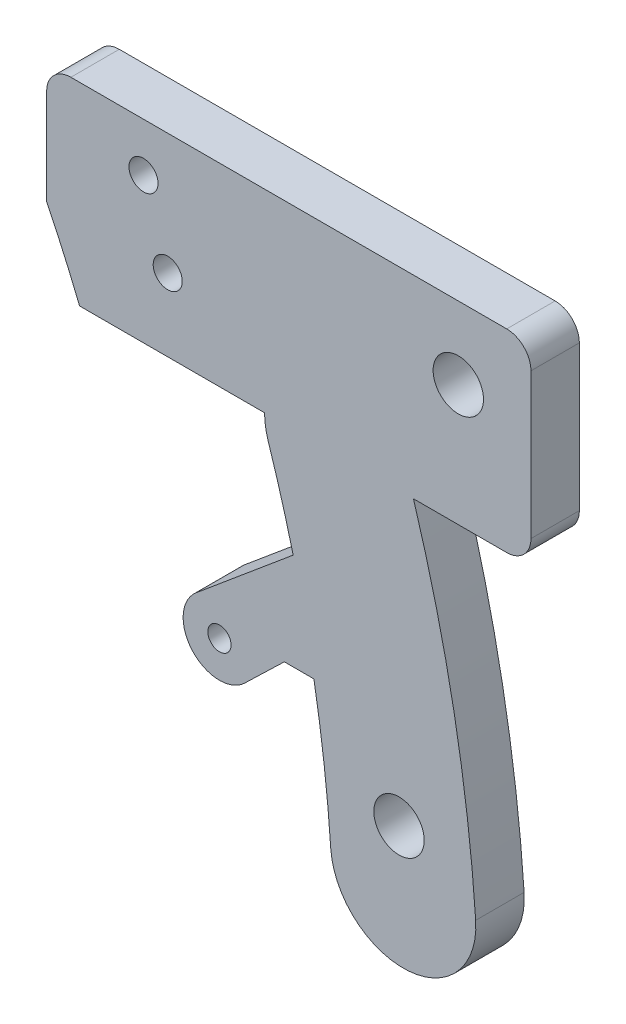
ISO-10303-21;
HEADER;
FILE_DESCRIPTION(('STEP AP214'),'2;1');
FILE_NAME('part.step','',(''),(''),'','','');
FILE_SCHEMA(('AUTOMOTIVE_DESIGN { 1 0 10303 214 1 1 1 1 }'));
ENDSEC;
DATA;
#1=APPLICATION_CONTEXT('core data for automotive mechanical design processes');
#2=APPLICATION_PROTOCOL_DEFINITION('international standard','automotive_design',2000,#1);
#3=PRODUCT_CONTEXT('',#1,'mechanical');
#4=PRODUCT('Part','Part','',(#3));
#5=PRODUCT_RELATED_PRODUCT_CATEGORY('part','',(#4));
#6=PRODUCT_DEFINITION_FORMATION('','',#4);
#7=PRODUCT_DEFINITION_CONTEXT('part definition',#1,'design');
#8=PRODUCT_DEFINITION('design','',#6,#7);
#9=PRODUCT_DEFINITION_SHAPE('','',#8);
#10=(LENGTH_UNIT() NAMED_UNIT(*) SI_UNIT(.MILLI.,.METRE.));
#11=(NAMED_UNIT(*) PLANE_ANGLE_UNIT() SI_UNIT($,.RADIAN.));
#12=(NAMED_UNIT(*) SI_UNIT($,.STERADIAN.) SOLID_ANGLE_UNIT());
#13=UNCERTAINTY_MEASURE_WITH_UNIT(LENGTH_MEASURE(1.E-05),#10,'distance_accuracy_value','');
#14=(GEOMETRIC_REPRESENTATION_CONTEXT(3) GLOBAL_UNCERTAINTY_ASSIGNED_CONTEXT((#13)) GLOBAL_UNIT_ASSIGNED_CONTEXT((#10,
#11,#12)) REPRESENTATION_CONTEXT('',''));
#15=CARTESIAN_POINT('',(0.,0.,0.));
#16=DIRECTION('',(0.,0.,1.));
#17=DIRECTION('',(1.,0.,0.));
#18=AXIS2_PLACEMENT_3D('',#15,#16,#17);
#19=CARTESIAN_POINT('',(0.,0.,6.35));
#20=DIRECTION('',(0.,0.,-1.));
#21=DIRECTION('',(-1.,0.,0.));
#22=AXIS2_PLACEMENT_3D('',#19,#20,#21);
#23=CYLINDRICAL_SURFACE('',#22,174.625);
#24=DIRECTION('',(0.,0.,1.));
#25=VECTOR('',#24,1.);
#26=CARTESIAN_POINT('',(169.282889621928,42.8625,-25.6306640082541));
#27=LINE('',#26,#25);
#28=CARTESIAN_POINT('',(169.282889621928,42.8625,0.));
#29=VERTEX_POINT('',#28);
#30=CARTESIAN_POINT('',(169.282889621928,42.8625,6.35));
#31=VERTEX_POINT('',#30);
#32=EDGE_CURVE('E50',#29,#31,#27,.T.);
#33=ORIENTED_EDGE('',*,*,#32,.T.);
#34=CARTESIAN_POINT('',(0.,0.,6.35));
#35=DIRECTION('',(0.,0.,1.));
#36=DIRECTION('',(1.,0.,0.));
#37=AXIS2_PLACEMENT_3D('',#34,#35,#36);
#38=CIRCLE('',#37,174.625);
#39=CARTESIAN_POINT('',(166.0027250575,54.1939655172414,6.35));
#40=VERTEX_POINT('',#39);
#41=EDGE_CURVE('E298',#31,#40,#38,.T.);
#42=ORIENTED_EDGE('',*,*,#41,.T.);
#43=DIRECTION('',(0.,0.,-1.));
#44=VECTOR('',#43,1.);
#45=CARTESIAN_POINT('',(166.0027250575,54.1939655172414,6.35));
#46=LINE('',#45,#44);
#47=CARTESIAN_POINT('',(166.0027250575,54.1939655172414,0.));
#48=VERTEX_POINT('',#47);
#49=EDGE_CURVE('E225',#40,#48,#46,.T.);
#50=ORIENTED_EDGE('',*,*,#49,.T.);
#51=CARTESIAN_POINT('',(0.,0.,0.));
#52=DIRECTION('',(0.,0.,1.));
#53=DIRECTION('',(1.,0.,0.));
#54=AXIS2_PLACEMENT_3D('',#51,#52,#53);
#55=CIRCLE('',#54,174.625);
#56=EDGE_CURVE('E189',#29,#48,#55,.T.);
#57=ORIENTED_EDGE('',*,*,#56,.F.);
#58=EDGE_LOOP('',(#33,#42,#50,#57));
#59=FACE_BOUND('',#58,.T.);
#60=ADVANCED_FACE('F35',(#59),#23,.F.);
#61=CARTESIAN_POINT('',(0.,0.,6.35));
#62=DIRECTION('',(0.,0.,-1.));
#63=DIRECTION('',(-1.,0.,0.));
#64=AXIS2_PLACEMENT_3D('',#61,#62,#63);
#65=CYLINDRICAL_SURFACE('',#64,152.4);
#66=CARTESIAN_POINT('',(0.,0.,0.));
#67=DIRECTION('',(0.,0.,1.));
#68=DIRECTION('',(1.,0.,0.));
#69=AXIS2_PLACEMENT_3D('',#66,#67,#68);
#70=CIRCLE('',#69,152.4);
#71=CARTESIAN_POINT('',(141.278581179172,57.15,0.));
#72=VERTEX_POINT('',#71);
#73=CARTESIAN_POINT('',(136.957419151546,66.8462814175013,0.));
#74=VERTEX_POINT('',#73);
#75=EDGE_CURVE('E283',#72,#74,#70,.T.);
#76=ORIENTED_EDGE('',*,*,#75,.F.);
#77=DIRECTION('',(0.,0.,-1.));
#78=VECTOR('',#77,1.);
#79=CARTESIAN_POINT('',(141.278581179172,57.15,6.35));
#80=LINE('',#79,#78);
#81=CARTESIAN_POINT('',(141.278581179172,57.15,6.35));
#82=VERTEX_POINT('',#81);
#83=EDGE_CURVE('E231',#82,#72,#80,.T.);
#84=ORIENTED_EDGE('',*,*,#83,.F.);
#85=CARTESIAN_POINT('',(0.,0.,6.35));
#86=DIRECTION('',(0.,0.,1.));
#87=DIRECTION('',(1.,0.,0.));
#88=AXIS2_PLACEMENT_3D('',#85,#86,#87);
#89=CIRCLE('',#88,152.4);
#90=CARTESIAN_POINT('',(136.957419151546,66.8462814175013,6.35));
#91=VERTEX_POINT('',#90);
#92=EDGE_CURVE('E310',#82,#91,#89,.T.);
#93=ORIENTED_EDGE('',*,*,#92,.T.);
#94=DIRECTION('',(0.,0.,-1.));
#95=VECTOR('',#94,1.);
#96=CARTESIAN_POINT('',(136.957419151546,66.8462814175013,6.35));
#97=LINE('',#96,#95);
#98=EDGE_CURVE('E213',#91,#74,#97,.T.);
#99=ORIENTED_EDGE('',*,*,#98,.T.);
#100=EDGE_LOOP('',(#76,#84,#93,#99));
#101=FACE_BOUND('',#100,.T.);
#102=ADVANCED_FACE('F380',(#101),#65,.F.);
#103=CARTESIAN_POINT('',(0.,57.15,6.35));
#104=DIRECTION('',(0.,1.,0.));
#105=DIRECTION('',(-1.,0.,0.));
#106=AXIS2_PLACEMENT_3D('',#103,#104,#105);
#107=PLANE('',#106);
#108=DIRECTION('',(1.,0.,0.));
#109=VECTOR('',#108,1.);
#110=CARTESIAN_POINT('',(0.,57.15,0.));
#111=LINE('',#110,#109);
#112=CARTESIAN_POINT('',(165.532419151546,57.15,0.));
#113=VERTEX_POINT('',#112);
#114=EDGE_CURVE('E285',#72,#113,#111,.T.);
#115=ORIENTED_EDGE('',*,*,#114,.T.);
#116=DIRECTION('',(0.,0.,-1.));
#117=VECTOR('',#116,1.);
#118=CARTESIAN_POINT('',(165.532419151546,57.15,6.35));
#119=LINE('',#118,#117);
#120=CARTESIAN_POINT('',(165.532419151546,57.15,6.35));
#121=VERTEX_POINT('',#120);
#122=EDGE_CURVE('E228',#121,#113,#119,.T.);
#123=ORIENTED_EDGE('',*,*,#122,.F.);
#124=DIRECTION('',(1.,0.,0.));
#125=VECTOR('',#124,1.);
#126=CARTESIAN_POINT('',(0.,57.15,6.35));
#127=LINE('',#126,#125);
#128=EDGE_CURVE('E308',#82,#121,#127,.T.);
#129=ORIENTED_EDGE('',*,*,#128,.F.);
#130=ORIENTED_EDGE('',*,*,#83,.T.);
#131=EDGE_LOOP('',(#115,#123,#129,#130));
#132=FACE_BOUND('',#131,.T.);
#133=ADVANCED_FACE('F381',(#132),#107,.F.);
#134=CARTESIAN_POINT('',(175.057419151546,57.15,6.35));
#135=DIRECTION('',(0.,0.,-1.));
#136=DIRECTION('',(-1.,0.,0.));
#137=AXIS2_PLACEMENT_3D('',#134,#135,#136);
#138=CYLINDRICAL_SURFACE('',#137,9.525);
#139=CARTESIAN_POINT('',(175.057419151546,57.15,0.));
#140=DIRECTION('',(0.,0.,1.));
#141=DIRECTION('',(1.,0.,0.));
#142=AXIS2_PLACEMENT_3D('',#139,#140,#141);
#143=CIRCLE('',#142,9.525);
#144=EDGE_CURVE('E193',#113,#48,#143,.T.);
#145=ORIENTED_EDGE('',*,*,#144,.T.);
#146=ORIENTED_EDGE('',*,*,#49,.F.);
#147=CARTESIAN_POINT('',(175.057419151546,57.15,6.35));
#148=DIRECTION('',(0.,0.,1.));
#149=DIRECTION('',(1.,0.,0.));
#150=AXIS2_PLACEMENT_3D('',#147,#148,#149);
#151=CIRCLE('',#150,9.525);
#152=EDGE_CURVE('E301',#121,#40,#151,.T.);
#153=ORIENTED_EDGE('',*,*,#152,.F.);
#154=ORIENTED_EDGE('',*,*,#122,.T.);
#155=EDGE_LOOP('',(#145,#146,#153,#154));
#156=FACE_BOUND('',#155,.T.);
#157=ADVANCED_FACE('F293',(#156),#138,.T.);
#158=DIRECTION('',(0.,0.,1.));
#159=VECTOR('',#158,1.);
#160=CARTESIAN_POINT('',(172.000332030929,30.1625,-25.6306640082541));
#161=LINE('',#160,#159);
#162=CARTESIAN_POINT('',(172.000332030929,30.1625,0.));
#163=VERTEX_POINT('',#162);
#164=CARTESIAN_POINT('',(172.000332030929,30.1625,6.35));
#165=VERTEX_POINT('',#164);
#166=EDGE_CURVE('E165',#163,#165,#161,.T.);
#167=ORIENTED_EDGE('',*,*,#166,.F.);
#168=CARTESIAN_POINT('',(174.209225600524,12.0431034482759,0.));
#169=VERTEX_POINT('',#168);
#170=EDGE_CURVE('E178',#169,#163,#55,.T.);
#171=ORIENTED_EDGE('',*,*,#170,.F.);
#172=DIRECTION('',(0.,0.,-1.));
#173=VECTOR('',#172,1.);
#174=CARTESIAN_POINT('',(174.209225600524,12.0431034482759,6.35));
#175=LINE('',#174,#173);
#176=CARTESIAN_POINT('',(174.209225600524,12.0431034482759,6.35));
#177=VERTEX_POINT('',#176);
#178=EDGE_CURVE('E223',#177,#169,#175,.T.);
#179=ORIENTED_EDGE('',*,*,#178,.F.);
#180=EDGE_CURVE('E180',#177,#165,#38,.T.);
#181=ORIENTED_EDGE('',*,*,#180,.T.);
#182=EDGE_LOOP('',(#167,#171,#179,#181));
#183=FACE_BOUND('',#182,.T.);
#184=ADVANCED_FACE('F177',(#183),#23,.F.);
#185=CARTESIAN_POINT('',(183.711546996916,12.7,6.35));
#186=DIRECTION('',(0.,0.,-1.));
#187=DIRECTION('',(-1.,0.,0.));
#188=AXIS2_PLACEMENT_3D('',#185,#186,#187);
#189=CYLINDRICAL_SURFACE('',#188,9.52499999999998);
#190=CARTESIAN_POINT('',(183.711546996916,12.7,0.));
#191=DIRECTION('',(0.,0.,1.));
#192=DIRECTION('',(1.,0.,0.));
#193=AXIS2_PLACEMENT_3D('',#190,#191,#192);
#194=CIRCLE('',#193,9.52499999999998);
#195=CARTESIAN_POINT('',(193.213868393308,13.3568965517241,0.));
#196=VERTEX_POINT('',#195);
#197=EDGE_CURVE('E188',#169,#196,#194,.T.);
#198=ORIENTED_EDGE('',*,*,#197,.T.);
#199=DIRECTION('',(0.,0.,-1.));
#200=VECTOR('',#199,1.);
#201=CARTESIAN_POINT('',(193.213868393308,13.3568965517241,6.35));
#202=LINE('',#201,#200);
#203=CARTESIAN_POINT('',(193.213868393308,13.3568965517241,6.35));
#204=VERTEX_POINT('',#203);
#205=EDGE_CURVE('E220',#204,#196,#202,.T.);
#206=ORIENTED_EDGE('',*,*,#205,.F.);
#207=CARTESIAN_POINT('',(183.711546996916,12.7,6.35));
#208=DIRECTION('',(0.,0.,1.));
#209=DIRECTION('',(1.,0.,0.));
#210=AXIS2_PLACEMENT_3D('',#207,#208,#209);
#211=CIRCLE('',#210,9.52499999999998);
#212=EDGE_CURVE('E314',#177,#204,#211,.T.);
#213=ORIENTED_EDGE('',*,*,#212,.F.);
#214=ORIENTED_EDGE('',*,*,#178,.T.);
#215=EDGE_LOOP('',(#198,#206,#213,#214));
#216=FACE_BOUND('',#215,.T.);
#217=ADVANCED_FACE('F339',(#216),#189,.T.);
#218=CARTESIAN_POINT('',(0.,0.,6.35));
#219=DIRECTION('',(0.,0.,-1.));
#220=DIRECTION('',(-1.,0.,0.));
#221=AXIS2_PLACEMENT_3D('',#218,#219,#220);
#222=CYLINDRICAL_SURFACE('',#221,193.675);
#223=CARTESIAN_POINT('',(0.,0.,0.));
#224=DIRECTION('',(0.,0.,1.));
#225=DIRECTION('',(1.,0.,0.));
#226=AXIS2_PLACEMENT_3D('',#223,#224,#225);
#227=CIRCLE('',#226,193.675);
#228=CARTESIAN_POINT('',(185.051028435402,57.15,0.));
#229=VERTEX_POINT('',#228);
#230=EDGE_CURVE('E191',#196,#229,#227,.T.);
#231=ORIENTED_EDGE('',*,*,#230,.T.);
#232=DIRECTION('',(0.,0.,-1.));
#233=VECTOR('',#232,1.);
#234=CARTESIAN_POINT('',(185.051028435402,57.15,6.35));
#235=LINE('',#234,#233);
#236=CARTESIAN_POINT('',(185.051028435402,57.15,6.35));
#237=VERTEX_POINT('',#236);
#238=EDGE_CURVE('E216',#237,#229,#235,.T.);
#239=ORIENTED_EDGE('',*,*,#238,.F.);
#240=CARTESIAN_POINT('',(0.,0.,6.35));
#241=DIRECTION('',(0.,0.,1.));
#242=DIRECTION('',(1.,0.,0.));
#243=AXIS2_PLACEMENT_3D('',#240,#241,#242);
#244=CIRCLE('',#243,193.675);
#245=EDGE_CURVE('E317',#204,#237,#244,.T.);
#246=ORIENTED_EDGE('',*,*,#245,.F.);
#247=ORIENTED_EDGE('',*,*,#205,.T.);
#248=EDGE_LOOP('',(#231,#239,#246,#247));
#249=FACE_BOUND('',#248,.T.);
#250=ADVANCED_FACE('F335',(#249),#222,.T.);
#251=CARTESIAN_POINT('',(0.,57.15,6.35));
#252=DIRECTION('',(0.,1.,0.));
#253=DIRECTION('',(0.,0.,1.));
#254=AXIS2_PLACEMENT_3D('',#251,#252,#253);
#255=PLANE('',#254);
#256=DIRECTION('',(1.,0.,0.));
#257=VECTOR('',#256,1.);
#258=CARTESIAN_POINT('',(0.,57.15,0.));
#259=LINE('',#258,#257);
#260=CARTESIAN_POINT('',(197.282419151546,57.15,0.));
#261=VERTEX_POINT('',#260);
#262=EDGE_CURVE('E199',#229,#261,#259,.T.);
#263=ORIENTED_EDGE('',*,*,#262,.T.);
#264=DIRECTION('',(0.,0.,-1.));
#265=VECTOR('',#264,1.);
#266=CARTESIAN_POINT('',(197.282419151546,57.15,6.35));
#267=LINE('',#266,#265);
#268=CARTESIAN_POINT('',(197.282419151546,57.15,6.35));
#269=VERTEX_POINT('',#268);
#270=EDGE_CURVE('E244',#261,#269,#267,.F.);
#271=ORIENTED_EDGE('',*,*,#270,.T.);
#272=DIRECTION('',(1.,0.,0.));
#273=VECTOR('',#272,1.);
#274=CARTESIAN_POINT('',(0.,57.15,6.35));
#275=LINE('',#274,#273);
#276=EDGE_CURVE('E320',#237,#269,#275,.T.);
#277=ORIENTED_EDGE('',*,*,#276,.F.);
#278=ORIENTED_EDGE('',*,*,#238,.T.);
#279=EDGE_LOOP('',(#263,#271,#277,#278));
#280=FACE_BOUND('',#279,.T.);
#281=ADVANCED_FACE('F332',(#280),#255,.F.);
#282=CARTESIAN_POINT('',(200.457419151546,0.,6.35));
#283=DIRECTION('',(1.,0.,0.));
#284=DIRECTION('',(0.,0.,-1.));
#285=AXIS2_PLACEMENT_3D('',#282,#283,#284);
#286=PLANE('',#285);
#287=DIRECTION('',(0.,-1.,0.));
#288=VECTOR('',#287,1.);
#289=CARTESIAN_POINT('',(200.457419151546,0.,6.35));
#290=LINE('',#289,#288);
#291=CARTESIAN_POINT('',(200.457419151546,79.375,6.35));
#292=VERTEX_POINT('',#291);
#293=CARTESIAN_POINT('',(200.457419151546,60.325,6.35));
#294=VERTEX_POINT('',#293);
#295=EDGE_CURVE('E276',#292,#294,#290,.T.);
#296=ORIENTED_EDGE('',*,*,#295,.T.);
#297=DIRECTION('',(0.,0.,-1.));
#298=VECTOR('',#297,1.);
#299=CARTESIAN_POINT('',(200.457419151546,60.325,0.));
#300=LINE('',#299,#298);
#301=CARTESIAN_POINT('',(200.457419151546,60.325,0.));
#302=VERTEX_POINT('',#301);
#303=EDGE_CURVE('E235',#294,#302,#300,.T.);
#304=ORIENTED_EDGE('',*,*,#303,.T.);
#305=DIRECTION('',(0.,-1.,0.));
#306=VECTOR('',#305,1.);
#307=CARTESIAN_POINT('',(200.457419151546,0.,0.));
#308=LINE('',#307,#306);
#309=CARTESIAN_POINT('',(200.457419151546,79.375,0.));
#310=VERTEX_POINT('',#309);
#311=EDGE_CURVE('E202',#310,#302,#308,.T.);
#312=ORIENTED_EDGE('',*,*,#311,.F.);
#313=DIRECTION('',(0.,0.,-1.));
#314=VECTOR('',#313,1.);
#315=CARTESIAN_POINT('',(200.457419151546,79.375,6.35));
#316=LINE('',#315,#314);
#317=EDGE_CURVE('E233',#310,#292,#316,.F.);
#318=ORIENTED_EDGE('',*,*,#317,.T.);
#319=EDGE_LOOP('',(#296,#304,#312,#318));
#320=FACE_BOUND('',#319,.T.);
#321=ADVANCED_FACE('F325',(#320),#286,.T.);
#322=CARTESIAN_POINT('',(0.,82.55,6.35));
#323=DIRECTION('',(0.,1.,0.));
#324=DIRECTION('',(0.,0.,1.));
#325=AXIS2_PLACEMENT_3D('',#322,#323,#324);
#326=PLANE('',#325);
#327=DIRECTION('',(1.,0.,0.));
#328=VECTOR('',#327,1.);
#329=CARTESIAN_POINT('',(0.,82.55,6.35));
#330=LINE('',#329,#328);
#331=CARTESIAN_POINT('',(140.132419151546,82.55,6.35));
#332=VERTEX_POINT('',#331);
#333=CARTESIAN_POINT('',(197.282419151546,82.55,6.35));
#334=VERTEX_POINT('',#333);
#335=EDGE_CURVE('E259',#332,#334,#330,.T.);
#336=ORIENTED_EDGE('',*,*,#335,.T.);
#337=DIRECTION('',(0.,0.,-1.));
#338=VECTOR('',#337,1.);
#339=CARTESIAN_POINT('',(197.282419151546,82.55,6.35));
#340=LINE('',#339,#338);
#341=CARTESIAN_POINT('',(197.282419151546,82.55,0.));
#342=VERTEX_POINT('',#341);
#343=EDGE_CURVE('E43',#334,#342,#340,.T.);
#344=ORIENTED_EDGE('',*,*,#343,.T.);
#345=DIRECTION('',(1.,0.,0.));
#346=VECTOR('',#345,1.);
#347=CARTESIAN_POINT('',(0.,82.55,0.));
#348=LINE('',#347,#346);
#349=CARTESIAN_POINT('',(140.132419151546,82.55,0.));
#350=VERTEX_POINT('',#349);
#351=EDGE_CURVE('E204',#350,#342,#348,.T.);
#352=ORIENTED_EDGE('',*,*,#351,.F.);
#353=DIRECTION('',(0.,0.,-1.));
#354=VECTOR('',#353,1.);
#355=CARTESIAN_POINT('',(140.132419151546,82.55,6.35));
#356=LINE('',#355,#354);
#357=EDGE_CURVE('E251',#350,#332,#356,.F.);
#358=ORIENTED_EDGE('',*,*,#357,.T.);
#359=EDGE_LOOP('',(#336,#344,#352,#358));
#360=FACE_BOUND('',#359,.T.);
#361=ADVANCED_FACE('F257',(#360),#326,.T.);
#362=CARTESIAN_POINT('',(136.957419151546,-4.84131447390884E-13,6.35));
#363=DIRECTION('',(1.,0.,0.));
#364=DIRECTION('',(0.,1.,0.));
#365=AXIS2_PLACEMENT_3D('',#362,#363,#364);
#366=PLANE('',#365);
#367=DIRECTION('',(0.,-1.,0.));
#368=VECTOR('',#367,1.);
#369=CARTESIAN_POINT('',(136.957419151546,-4.84131447390884E-13,6.35));
#370=LINE('',#369,#368);
#371=CARTESIAN_POINT('',(136.957419151546,79.375,6.35));
#372=VERTEX_POINT('',#371);
#373=EDGE_CURVE('E270',#372,#91,#370,.T.);
#374=ORIENTED_EDGE('',*,*,#373,.F.);
#375=DIRECTION('',(0.,0.,-1.));
#376=VECTOR('',#375,1.);
#377=CARTESIAN_POINT('',(136.957419151546,79.375,0.));
#378=LINE('',#377,#376);
#379=CARTESIAN_POINT('',(136.957419151546,79.375,0.));
#380=VERTEX_POINT('',#379);
#381=EDGE_CURVE('E11',#372,#380,#378,.T.);
#382=ORIENTED_EDGE('',*,*,#381,.T.);
#383=DIRECTION('',(0.,-1.,0.));
#384=VECTOR('',#383,1.);
#385=CARTESIAN_POINT('',(136.957419151546,-4.84131447390884E-13,0.));
#386=LINE('',#385,#384);
#387=EDGE_CURVE('E207',#380,#74,#386,.T.);
#388=ORIENTED_EDGE('',*,*,#387,.T.);
#389=ORIENTED_EDGE('',*,*,#98,.F.);
#390=EDGE_LOOP('',(#374,#382,#388,#389));
#391=FACE_BOUND('',#390,.T.);
#392=ADVANCED_FACE('F268',(#391),#366,.F.);
#393=CARTESIAN_POINT('',(183.162004793571,19.05,6.35));
#394=DIRECTION('',(0.,0.,-1.));
#395=DIRECTION('',(-1.,0.,0.));
#396=AXIS2_PLACEMENT_3D('',#393,#394,#395);
#397=CYLINDRICAL_SURFACE('',#396,3.30200000000001);
#398=CARTESIAN_POINT('',(183.162004793571,19.05,6.35));
#399=DIRECTION('',(0.,0.,1.));
#400=DIRECTION('',(1.,0.,0.));
#401=AXIS2_PLACEMENT_3D('',#398,#399,#400);
#402=CIRCLE('',#401,3.30200000000001);
#403=CARTESIAN_POINT('',(186.464004793571,19.05,6.35));
#404=VERTEX_POINT('',#403);
#405=EDGE_CURVE('E212',#404,#404,#402,.T.);
#406=ORIENTED_EDGE('',*,*,#405,.T.);
#407=EDGE_LOOP('',(#406));
#408=FACE_BOUND('',#407,.T.);
#409=CARTESIAN_POINT('',(183.162004793571,19.05,0.));
#410=DIRECTION('',(0.,0.,1.));
#411=DIRECTION('',(1.,0.,0.));
#412=AXIS2_PLACEMENT_3D('',#409,#410,#411);
#413=CIRCLE('',#412,3.30200000000001);
#414=CARTESIAN_POINT('',(186.464004793571,19.05,0.));
#415=VERTEX_POINT('',#414);
#416=EDGE_CURVE('E280',#415,#415,#413,.T.);
#417=ORIENTED_EDGE('',*,*,#416,.F.);
#418=EDGE_LOOP('',(#417));
#419=FACE_BOUND('',#418,.T.);
#420=ADVANCED_FACE('F412',(#408,#419),#397,.F.);
#421=CARTESIAN_POINT('',(190.932419151546,73.025,6.35));
#422=DIRECTION('',(0.,0.,-1.));
#423=DIRECTION('',(-1.,0.,0.));
#424=AXIS2_PLACEMENT_3D('',#421,#422,#423);
#425=CYLINDRICAL_SURFACE('',#424,3.30200000000001);
#426=CARTESIAN_POINT('',(190.932419151546,73.025,6.35));
#427=DIRECTION('',(0.,0.,1.));
#428=DIRECTION('',(1.,0.,0.));
#429=AXIS2_PLACEMENT_3D('',#426,#427,#428);
#430=CIRCLE('',#429,3.30200000000001);
#431=CARTESIAN_POINT('',(194.234419151546,73.025,6.35));
#432=VERTEX_POINT('',#431);
#433=EDGE_CURVE('E217',#432,#432,#430,.T.);
#434=ORIENTED_EDGE('',*,*,#433,.T.);
#435=EDGE_LOOP('',(#434));
#436=FACE_BOUND('',#435,.T.);
#437=CARTESIAN_POINT('',(190.932419151546,73.025,0.));
#438=DIRECTION('',(0.,0.,1.));
#439=DIRECTION('',(1.,0.,0.));
#440=AXIS2_PLACEMENT_3D('',#437,#438,#439);
#441=CIRCLE('',#440,3.30200000000001);
#442=CARTESIAN_POINT('',(194.234419151546,73.025,0.));
#443=VERTEX_POINT('',#442);
#444=EDGE_CURVE('E209',#443,#443,#441,.T.);
#445=ORIENTED_EDGE('',*,*,#444,.F.);
#446=EDGE_LOOP('',(#445));
#447=FACE_BOUND('',#446,.T.);
#448=ADVANCED_FACE('F413',(#436,#447),#425,.F.);
#449=CARTESIAN_POINT('',(0.,0.,6.35));
#450=DIRECTION('',(0.,0.,1.));
#451=DIRECTION('',(1.,0.,0.));
#452=AXIS2_PLACEMENT_3D('',#449,#450,#451);
#453=PLANE('',#452);
#454=CARTESIAN_POINT('',(152.832419151546,66.675,6.35));
#455=DIRECTION('',(0.,0.,1.));
#456=DIRECTION('',(1.,0.,0.));
#457=AXIS2_PLACEMENT_3D('',#454,#455,#456);
#458=CIRCLE('',#457,1.90499999999999);
#459=CARTESIAN_POINT('',(154.737419151546,66.675,6.35));
#460=VERTEX_POINT('',#459);
#461=EDGE_CURVE('E370',#460,#460,#458,.T.);
#462=ORIENTED_EDGE('',*,*,#461,.F.);
#463=EDGE_LOOP('',(#462));
#464=FACE_BOUND('',#463,.T.);
#465=CARTESIAN_POINT('',(149.657419151546,76.2,6.35));
#466=DIRECTION('',(0.,0.,1.));
#467=DIRECTION('',(1.,0.,0.));
#468=AXIS2_PLACEMENT_3D('',#465,#466,#467);
#469=CIRCLE('',#468,1.90499999999999);
#470=CARTESIAN_POINT('',(151.562419151546,76.2,6.35));
#471=VERTEX_POINT('',#470);
#472=EDGE_CURVE('E373',#471,#471,#469,.T.);
#473=ORIENTED_EDGE('',*,*,#472,.F.);
#474=EDGE_LOOP('',(#473));
#475=FACE_BOUND('',#474,.T.);
#476=ORIENTED_EDGE('',*,*,#405,.F.);
#477=EDGE_LOOP('',(#476));
#478=FACE_BOUND('',#477,.T.);
#479=ORIENTED_EDGE('',*,*,#276,.T.);
#480=CARTESIAN_POINT('',(197.282419151546,60.325,6.35));
#481=DIRECTION('',(0.,0.,1.));
#482=DIRECTION('',(1.,0.,0.));
#483=AXIS2_PLACEMENT_3D('',#480,#481,#482);
#484=CIRCLE('',#483,3.175);
#485=EDGE_CURVE('E249',#269,#294,#484,.T.);
#486=ORIENTED_EDGE('',*,*,#485,.T.);
#487=ORIENTED_EDGE('',*,*,#295,.F.);
#488=CARTESIAN_POINT('',(197.282419151546,79.375,6.35));
#489=DIRECTION('',(0.,0.,1.));
#490=DIRECTION('',(1.,0.,0.));
#491=AXIS2_PLACEMENT_3D('',#488,#489,#490);
#492=CIRCLE('',#491,3.175);
#493=EDGE_CURVE('E247',#292,#334,#492,.T.);
#494=ORIENTED_EDGE('',*,*,#493,.T.);
#495=ORIENTED_EDGE('',*,*,#335,.F.);
#496=CARTESIAN_POINT('',(140.132419151546,79.375,6.35));
#497=DIRECTION('',(0.,0.,1.));
#498=DIRECTION('',(1.,0.,0.));
#499=AXIS2_PLACEMENT_3D('',#496,#497,#498);
#500=CIRCLE('',#499,3.175);
#501=EDGE_CURVE('E58',#332,#372,#500,.T.);
#502=ORIENTED_EDGE('',*,*,#501,.T.);
#503=ORIENTED_EDGE('',*,*,#373,.T.);
#504=ORIENTED_EDGE('',*,*,#92,.F.);
#505=ORIENTED_EDGE('',*,*,#128,.T.);
#506=ORIENTED_EDGE('',*,*,#152,.T.);
#507=ORIENTED_EDGE('',*,*,#41,.F.);
#508=DIRECTION('',(-0.767270506011874,-0.641323608332239,0.));
#509=VECTOR('',#508,1.);
#510=CARTESIAN_POINT('',(48.5340761908077,-58.0654831880885,6.35));
#511=LINE('',#510,#509);
#512=CARTESIAN_POINT('',(156.56127091236,32.2291257848815,6.35));
#513=VERTEX_POINT('',#512);
#514=EDGE_CURVE('E348',#31,#513,#511,.T.);
#515=ORIENTED_EDGE('',*,*,#514,.T.);
#516=CARTESIAN_POINT('',(159.615574597042,28.575,6.35));
#517=DIRECTION('',(0.,0.,1.));
#518=DIRECTION('',(1.,0.,0.));
#519=AXIS2_PLACEMENT_3D('',#516,#517,#518);
#520=CIRCLE('',#519,4.7625);
#521=CARTESIAN_POINT('',(162.921852431608,25.1471824537094,6.35));
#522=VERTEX_POINT('',#521);
#523=EDGE_CURVE('E345',#513,#522,#520,.T.);
#524=ORIENTED_EDGE('',*,*,#523,.T.);
#525=DIRECTION('',(-0.719751715756553,-0.69423156631307,0.));
#526=VECTOR('',#525,1.);
#527=CARTESIAN_POINT('',(65.9560011021494,-68.3805624250529,6.35));
#528=LINE('',#527,#526);
#529=CARTESIAN_POINT('',(168.121534474557,30.1625,6.35));
#530=VERTEX_POINT('',#529);
#531=EDGE_CURVE('E344',#530,#522,#528,.T.);
#532=ORIENTED_EDGE('',*,*,#531,.F.);
#533=DIRECTION('',(1.,0.,0.));
#534=VECTOR('',#533,1.);
#535=CARTESIAN_POINT('',(0.,30.1625,6.35));
#536=LINE('',#535,#534);
#537=EDGE_CURVE('E341',#530,#165,#536,.T.);
#538=ORIENTED_EDGE('',*,*,#537,.T.);
#539=ORIENTED_EDGE('',*,*,#180,.F.);
#540=ORIENTED_EDGE('',*,*,#212,.T.);
#541=ORIENTED_EDGE('',*,*,#245,.T.);
#542=EDGE_LOOP('',(#479,#486,#487,#494,#495,#502,#503,#504,#505,#506,#507,#515,#524,#532,#538,
#539,#540,#541));
#543=FACE_BOUND('',#542,.T.);
#544=ORIENTED_EDGE('',*,*,#433,.F.);
#545=EDGE_LOOP('',(#544));
#546=FACE_BOUND('',#545,.T.);
#547=CARTESIAN_POINT('',(159.615574597042,28.575,6.35));
#548=DIRECTION('',(0.,0.,1.));
#549=DIRECTION('',(1.,0.,0.));
#550=AXIS2_PLACEMENT_3D('',#547,#548,#549);
#551=CIRCLE('',#550,1.52400000000001);
#552=CARTESIAN_POINT('',(161.139574597042,28.575,6.35));
#553=VERTEX_POINT('',#552);
#554=EDGE_CURVE('E355',#553,#553,#551,.T.);
#555=ORIENTED_EDGE('',*,*,#554,.F.);
#556=EDGE_LOOP('',(#555));
#557=FACE_BOUND('',#556,.T.);
#558=ADVANCED_FACE('F305',(#464,#475,#478,#543,#546,#557),#453,.T.);
#559=CARTESIAN_POINT('',(0.,0.,0.));
#560=DIRECTION('',(0.,0.,1.));
#561=DIRECTION('',(1.,0.,0.));
#562=AXIS2_PLACEMENT_3D('',#559,#560,#561);
#563=PLANE('',#562);
#564=CARTESIAN_POINT('',(152.832419151546,66.675,0.));
#565=DIRECTION('',(0.,0.,1.));
#566=DIRECTION('',(1.,0.,0.));
#567=AXIS2_PLACEMENT_3D('',#564,#565,#566);
#568=CIRCLE('',#567,1.90499999999999);
#569=CARTESIAN_POINT('',(154.737419151546,66.675,0.));
#570=VERTEX_POINT('',#569);
#571=EDGE_CURVE('E361',#570,#570,#568,.F.);
#572=ORIENTED_EDGE('',*,*,#571,.F.);
#573=EDGE_LOOP('',(#572));
#574=FACE_BOUND('',#573,.T.);
#575=CARTESIAN_POINT('',(149.657419151546,76.2,0.));
#576=DIRECTION('',(0.,0.,1.));
#577=DIRECTION('',(1.,0.,0.));
#578=AXIS2_PLACEMENT_3D('',#575,#576,#577);
#579=CIRCLE('',#578,1.90499999999999);
#580=CARTESIAN_POINT('',(151.562419151546,76.2,0.));
#581=VERTEX_POINT('',#580);
#582=EDGE_CURVE('E284',#581,#581,#579,.F.);
#583=ORIENTED_EDGE('',*,*,#582,.F.);
#584=EDGE_LOOP('',(#583));
#585=FACE_BOUND('',#584,.T.);
#586=ORIENTED_EDGE('',*,*,#416,.T.);
#587=EDGE_LOOP('',(#586));
#588=FACE_BOUND('',#587,.T.);
#589=ORIENTED_EDGE('',*,*,#311,.T.);
#590=CARTESIAN_POINT('',(197.282419151546,60.325,0.));
#591=DIRECTION('',(0.,0.,1.));
#592=DIRECTION('',(1.,0.,0.));
#593=AXIS2_PLACEMENT_3D('',#590,#591,#592);
#594=CIRCLE('',#593,3.175);
#595=EDGE_CURVE('E242',#302,#261,#594,.F.);
#596=ORIENTED_EDGE('',*,*,#595,.T.);
#597=ORIENTED_EDGE('',*,*,#262,.F.);
#598=ORIENTED_EDGE('',*,*,#230,.F.);
#599=ORIENTED_EDGE('',*,*,#197,.F.);
#600=ORIENTED_EDGE('',*,*,#170,.T.);
#601=DIRECTION('',(-1.,0.,0.));
#602=VECTOR('',#601,1.);
#603=CARTESIAN_POINT('',(0.,30.1625,0.));
#604=LINE('',#603,#602);
#605=CARTESIAN_POINT('',(168.121534474557,30.1625,0.));
#606=VERTEX_POINT('',#605);
#607=EDGE_CURVE('E161',#163,#606,#604,.T.);
#608=ORIENTED_EDGE('',*,*,#607,.T.);
#609=DIRECTION('',(0.719751715756553,0.69423156631307,0.));
#610=VECTOR('',#609,1.);
#611=CARTESIAN_POINT('',(65.9560011021494,-68.3805624250529,0.));
#612=LINE('',#611,#610);
#613=CARTESIAN_POINT('',(162.921852431608,25.1471824537094,0.));
#614=VERTEX_POINT('',#613);
#615=EDGE_CURVE('E181',#614,#606,#612,.T.);
#616=ORIENTED_EDGE('',*,*,#615,.F.);
#617=CARTESIAN_POINT('',(159.615574597042,28.575,0.));
#618=DIRECTION('',(0.,0.,1.));
#619=DIRECTION('',(1.,0.,0.));
#620=AXIS2_PLACEMENT_3D('',#617,#618,#619);
#621=CIRCLE('',#620,4.7625);
#622=CARTESIAN_POINT('',(156.56127091236,32.2291257848815,0.));
#623=VERTEX_POINT('',#622);
#624=EDGE_CURVE('E171',#614,#623,#621,.F.);
#625=ORIENTED_EDGE('',*,*,#624,.T.);
#626=DIRECTION('',(0.767270506011874,0.641323608332239,0.));
#627=VECTOR('',#626,1.);
#628=CARTESIAN_POINT('',(48.5340761908077,-58.0654831880885,0.));
#629=LINE('',#628,#627);
#630=EDGE_CURVE('E172',#623,#29,#629,.T.);
#631=ORIENTED_EDGE('',*,*,#630,.T.);
#632=ORIENTED_EDGE('',*,*,#56,.T.);
#633=ORIENTED_EDGE('',*,*,#144,.F.);
#634=ORIENTED_EDGE('',*,*,#114,.F.);
#635=ORIENTED_EDGE('',*,*,#75,.T.);
#636=ORIENTED_EDGE('',*,*,#387,.F.);
#637=CARTESIAN_POINT('',(140.132419151546,79.375,0.));
#638=DIRECTION('',(0.,0.,1.));
#639=DIRECTION('',(1.,0.,0.));
#640=AXIS2_PLACEMENT_3D('',#637,#638,#639);
#641=CIRCLE('',#640,3.175);
#642=EDGE_CURVE('E238',#380,#350,#641,.F.);
#643=ORIENTED_EDGE('',*,*,#642,.T.);
#644=ORIENTED_EDGE('',*,*,#351,.T.);
#645=CARTESIAN_POINT('',(197.282419151546,79.375,0.));
#646=DIRECTION('',(0.,0.,1.));
#647=DIRECTION('',(1.,0.,0.));
#648=AXIS2_PLACEMENT_3D('',#645,#646,#647);
#649=CIRCLE('',#648,3.175);
#650=EDGE_CURVE('E240',#342,#310,#649,.F.);
#651=ORIENTED_EDGE('',*,*,#650,.T.);
#652=EDGE_LOOP('',(#589,#596,#597,#598,#599,#600,#608,#616,#625,#631,#632,#633,#634,#635,#636,
#643,#644,#651));
#653=FACE_BOUND('',#652,.T.);
#654=ORIENTED_EDGE('',*,*,#444,.T.);
#655=EDGE_LOOP('',(#654));
#656=FACE_BOUND('',#655,.T.);
#657=CARTESIAN_POINT('',(159.615574597042,28.575,0.));
#658=DIRECTION('',(0.,0.,1.));
#659=DIRECTION('',(1.,0.,0.));
#660=AXIS2_PLACEMENT_3D('',#657,#658,#659);
#661=CIRCLE('',#660,1.52400000000001);
#662=CARTESIAN_POINT('',(161.139574597042,28.575,0.));
#663=VERTEX_POINT('',#662);
#664=EDGE_CURVE('E351',#663,#663,#661,.F.);
#665=ORIENTED_EDGE('',*,*,#664,.F.);
#666=EDGE_LOOP('',(#665));
#667=FACE_BOUND('',#666,.T.);
#668=ADVANCED_FACE('F185',(#574,#585,#588,#653,#656,#667),#563,.F.);
#669=CARTESIAN_POINT('',(197.282419151546,60.325,6.35));
#670=DIRECTION('',(0.,0.,1.));
#671=DIRECTION('',(1.,0.,0.));
#672=AXIS2_PLACEMENT_3D('',#669,#670,#671);
#673=CYLINDRICAL_SURFACE('',#672,3.175);
#674=ORIENTED_EDGE('',*,*,#485,.F.);
#675=ORIENTED_EDGE('',*,*,#270,.F.);
#676=ORIENTED_EDGE('',*,*,#595,.F.);
#677=ORIENTED_EDGE('',*,*,#303,.F.);
#678=EDGE_LOOP('',(#674,#675,#676,#677));
#679=FACE_BOUND('',#678,.T.);
#680=ADVANCED_FACE('F329',(#679),#673,.T.);
#681=CARTESIAN_POINT('',(197.282419151546,79.375,6.35));
#682=DIRECTION('',(0.,0.,-1.));
#683=DIRECTION('',(-1.,0.,0.));
#684=AXIS2_PLACEMENT_3D('',#681,#682,#683);
#685=CYLINDRICAL_SURFACE('',#684,3.175);
#686=ORIENTED_EDGE('',*,*,#493,.F.);
#687=ORIENTED_EDGE('',*,*,#317,.F.);
#688=ORIENTED_EDGE('',*,*,#650,.F.);
#689=ORIENTED_EDGE('',*,*,#343,.F.);
#690=EDGE_LOOP('',(#686,#687,#688,#689));
#691=FACE_BOUND('',#690,.T.);
#692=ADVANCED_FACE('F528',(#691),#685,.T.);
#693=CARTESIAN_POINT('',(140.132419151546,79.375,6.35));
#694=DIRECTION('',(0.,0.,1.));
#695=DIRECTION('',(1.,0.,0.));
#696=AXIS2_PLACEMENT_3D('',#693,#694,#695);
#697=CYLINDRICAL_SURFACE('',#696,3.175);
#698=ORIENTED_EDGE('',*,*,#501,.F.);
#699=ORIENTED_EDGE('',*,*,#357,.F.);
#700=ORIENTED_EDGE('',*,*,#642,.F.);
#701=ORIENTED_EDGE('',*,*,#381,.F.);
#702=EDGE_LOOP('',(#698,#699,#700,#701));
#703=FACE_BOUND('',#702,.T.);
#704=ADVANCED_FACE('F37',(#703),#697,.T.);
#705=CARTESIAN_POINT('',(149.657419151546,76.2,-5.38815367264146));
#706=DIRECTION('',(0.,0.,1.));
#707=DIRECTION('',(1.,0.,0.));
#708=AXIS2_PLACEMENT_3D('',#705,#706,#707);
#709=CYLINDRICAL_SURFACE('',#708,1.90499999999999);
#710=ORIENTED_EDGE('',*,*,#582,.T.);
#711=EDGE_LOOP('',(#710));
#712=FACE_BOUND('',#711,.T.);
#713=ORIENTED_EDGE('',*,*,#472,.T.);
#714=EDGE_LOOP('',(#713));
#715=FACE_BOUND('',#714,.T.);
#716=ADVANCED_FACE('F423',(#712,#715),#709,.F.);
#717=CARTESIAN_POINT('',(152.832419151546,66.675,-5.38815367264146));
#718=DIRECTION('',(0.,0.,1.));
#719=DIRECTION('',(1.,0.,0.));
#720=AXIS2_PLACEMENT_3D('',#717,#718,#719);
#721=CYLINDRICAL_SURFACE('',#720,1.90499999999999);
#722=ORIENTED_EDGE('',*,*,#571,.T.);
#723=EDGE_LOOP('',(#722));
#724=FACE_BOUND('',#723,.T.);
#725=ORIENTED_EDGE('',*,*,#461,.T.);
#726=EDGE_LOOP('',(#725));
#727=FACE_BOUND('',#726,.T.);
#728=ADVANCED_FACE('F426',(#724,#727),#721,.F.);
#729=CARTESIAN_POINT('',(48.5340761908077,-58.0654831880885,-25.6306640082541));
#730=DIRECTION('',(-0.641323608332239,0.767270506011874,0.));
#731=DIRECTION('',(-0.767270506011874,-0.641323608332239,0.));
#732=AXIS2_PLACEMENT_3D('',#729,#730,#731);
#733=PLANE('',#732);
#734=ORIENTED_EDGE('',*,*,#630,.F.);
#735=DIRECTION('',(0.,0.,1.));
#736=VECTOR('',#735,1.);
#737=CARTESIAN_POINT('',(156.56127091236,32.2291257848815,-25.6306640082541));
#738=LINE('',#737,#736);
#739=EDGE_CURVE('E362',#623,#513,#738,.T.);
#740=ORIENTED_EDGE('',*,*,#739,.T.);
#741=ORIENTED_EDGE('',*,*,#514,.F.);
#742=ORIENTED_EDGE('',*,*,#32,.F.);
#743=EDGE_LOOP('',(#734,#740,#741,#742));
#744=FACE_BOUND('',#743,.T.);
#745=ADVANCED_FACE('F430',(#744),#733,.T.);
#746=CARTESIAN_POINT('',(0.,30.1625,-25.6306640082541));
#747=DIRECTION('',(0.,-1.,0.));
#748=DIRECTION('',(0.,0.,-1.));
#749=AXIS2_PLACEMENT_3D('',#746,#747,#748);
#750=PLANE('',#749);
#751=ORIENTED_EDGE('',*,*,#607,.F.);
#752=ORIENTED_EDGE('',*,*,#166,.T.);
#753=ORIENTED_EDGE('',*,*,#537,.F.);
#754=DIRECTION('',(0.,0.,1.));
#755=VECTOR('',#754,1.);
#756=CARTESIAN_POINT('',(168.121534474557,30.1625,-25.6306640082541));
#757=LINE('',#756,#755);
#758=EDGE_CURVE('E167',#606,#530,#757,.T.);
#759=ORIENTED_EDGE('',*,*,#758,.F.);
#760=EDGE_LOOP('',(#751,#752,#753,#759));
#761=FACE_BOUND('',#760,.T.);
#762=ADVANCED_FACE('F163',(#761),#750,.T.);
#763=CARTESIAN_POINT('',(65.9560011021494,-68.3805624250529,-25.6306640082541));
#764=DIRECTION('',(-0.69423156631307,0.719751715756553,0.));
#765=DIRECTION('',(-0.719751715756553,-0.69423156631307,0.));
#766=AXIS2_PLACEMENT_3D('',#763,#764,#765);
#767=PLANE('',#766);
#768=DIRECTION('',(0.,0.,1.));
#769=VECTOR('',#768,1.);
#770=CARTESIAN_POINT('',(162.921852431608,25.1471824537094,-25.6306640082541));
#771=LINE('',#770,#769);
#772=EDGE_CURVE('E354',#614,#522,#771,.T.);
#773=ORIENTED_EDGE('',*,*,#772,.F.);
#774=ORIENTED_EDGE('',*,*,#615,.T.);
#775=ORIENTED_EDGE('',*,*,#758,.T.);
#776=ORIENTED_EDGE('',*,*,#531,.T.);
#777=EDGE_LOOP('',(#773,#774,#775,#776));
#778=FACE_BOUND('',#777,.T.);
#779=ADVANCED_FACE('F436',(#778),#767,.F.);
#780=CARTESIAN_POINT('',(159.615574597042,28.575,-25.6306640082541));
#781=DIRECTION('',(0.,0.,1.));
#782=DIRECTION('',(1.,0.,0.));
#783=AXIS2_PLACEMENT_3D('',#780,#781,#782);
#784=CYLINDRICAL_SURFACE('',#783,1.52400000000001);
#785=ORIENTED_EDGE('',*,*,#664,.T.);
#786=EDGE_LOOP('',(#785));
#787=FACE_BOUND('',#786,.T.);
#788=ORIENTED_EDGE('',*,*,#554,.T.);
#789=EDGE_LOOP('',(#788));
#790=FACE_BOUND('',#789,.T.);
#791=ADVANCED_FACE('F439',(#787,#790),#784,.F.);
#792=CARTESIAN_POINT('',(159.615574597042,28.575,-25.6306640082541));
#793=DIRECTION('',(0.,0.,1.));
#794=DIRECTION('',(1.,0.,0.));
#795=AXIS2_PLACEMENT_3D('',#792,#793,#794);
#796=CYLINDRICAL_SURFACE('',#795,4.7625);
#797=ORIENTED_EDGE('',*,*,#624,.F.);
#798=ORIENTED_EDGE('',*,*,#772,.T.);
#799=ORIENTED_EDGE('',*,*,#523,.F.);
#800=ORIENTED_EDGE('',*,*,#739,.F.);
#801=EDGE_LOOP('',(#797,#798,#799,#800));
#802=FACE_BOUND('',#801,.T.);
#803=ADVANCED_FACE('F441',(#802),#796,.T.);
#804=CLOSED_SHELL('',(#60,#102,#133,#157,#184,#217,#250,#281,#321,#361,#392,#420,#448,#558,#668,
#680,#692,#704,#716,#728,#745,#762,#779,#791,#803));
#805=MANIFOLD_SOLID_BREP('B2',#804);
#806=ADVANCED_BREP_SHAPE_REPRESENTATION('',(#18,#805),#14);
#807=SHAPE_DEFINITION_REPRESENTATION(#9,#806);
ENDSEC;
END-ISO-10303-21;
